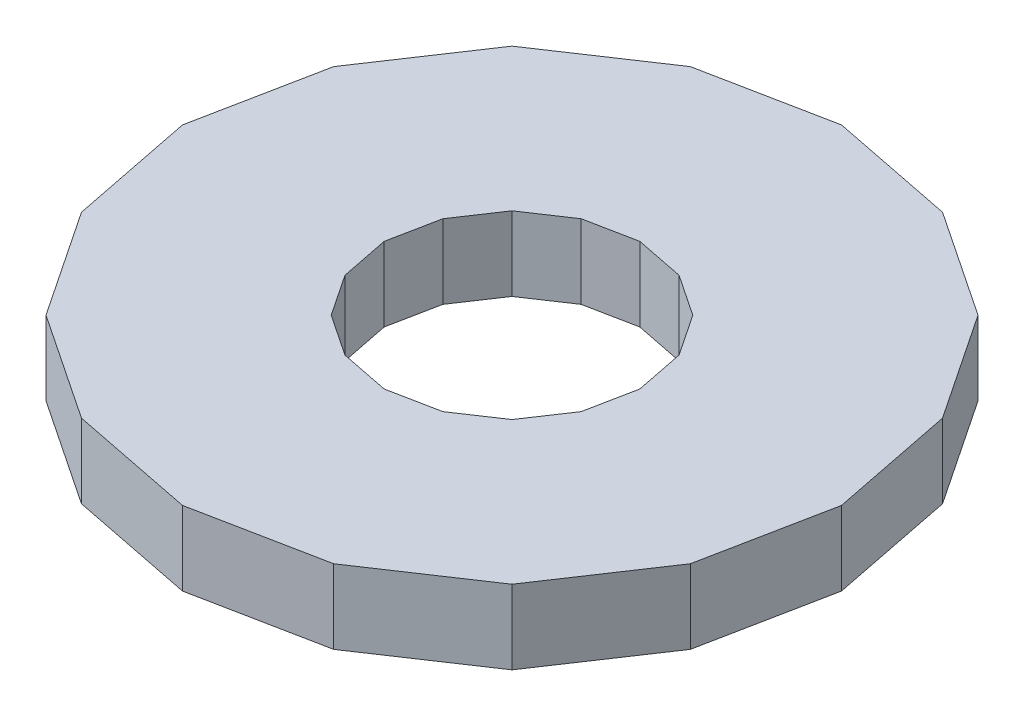
ISO-10303-21;
HEADER;
FILE_DESCRIPTION(('STEP AP214'),'2;1');
FILE_NAME('part.step','',(''),(''),'','','');
FILE_SCHEMA(('AUTOMOTIVE_DESIGN { 1 0 10303 214 1 1 1 1 }'));
ENDSEC;
DATA;
#1=APPLICATION_CONTEXT('core data for automotive mechanical design processes');
#2=APPLICATION_PROTOCOL_DEFINITION('international standard','automotive_design',2000,#1);
#3=PRODUCT_CONTEXT('',#1,'mechanical');
#4=PRODUCT('Part','Part','',(#3));
#5=PRODUCT_RELATED_PRODUCT_CATEGORY('part','',(#4));
#6=PRODUCT_DEFINITION_FORMATION('','',#4);
#7=PRODUCT_DEFINITION_CONTEXT('part definition',#1,'design');
#8=PRODUCT_DEFINITION('design','',#6,#7);
#9=PRODUCT_DEFINITION_SHAPE('','',#8);
#10=(LENGTH_UNIT() NAMED_UNIT(*) SI_UNIT(.MILLI.,.METRE.));
#11=(NAMED_UNIT(*) PLANE_ANGLE_UNIT() SI_UNIT($,.RADIAN.));
#12=(NAMED_UNIT(*) SI_UNIT($,.STERADIAN.) SOLID_ANGLE_UNIT());
#13=UNCERTAINTY_MEASURE_WITH_UNIT(LENGTH_MEASURE(1.E-05),#10,'distance_accuracy_value','');
#14=(GEOMETRIC_REPRESENTATION_CONTEXT(3) GLOBAL_UNCERTAINTY_ASSIGNED_CONTEXT((#13)) GLOBAL_UNIT_ASSIGNED_CONTEXT((#10,
#11,#12)) REPRESENTATION_CONTEXT('',''));
#15=CARTESIAN_POINT('',(0.,0.,0.));
#16=DIRECTION('',(0.,0.,1.));
#17=DIRECTION('',(1.,0.,0.));
#18=AXIS2_PLACEMENT_3D('',#15,#16,#17);
#19=CARTESIAN_POINT('',(0.,19.05,0.));
#20=DIRECTION('',(0.,1.,0.));
#21=DIRECTION('',(0.,0.,1.));
#22=AXIS2_PLACEMENT_3D('',#19,#20,#21);
#23=PLANE('',#22);
#24=DIRECTION('',(0.195090322016116,0.,-0.980785280403233));
#25=VECTOR('',#24,1.);
#26=CARTESIAN_POINT('',(78.1855856514525,19.05,32.3855299589137));
#27=LINE('',#26,#25);
#28=CARTESIAN_POINT('',(78.1855856514525,19.05,32.3855299589137));
#29=VERTEX_POINT('',#28);
#30=CARTESIAN_POINT('',(84.6274680844246,19.05,-1.06512029289064E-12));
#31=VERTEX_POINT('',#30);
#32=EDGE_CURVE('E386',#29,#31,#27,.T.);
#33=ORIENTED_EDGE('',*,*,#32,.T.);
#34=DIRECTION('',(-0.19509032201614,0.,-0.980785280403228));
#35=VECTOR('',#34,1.);
#36=CARTESIAN_POINT('',(84.6274680844246,19.05,-1.06512029289064E-12));
#37=LINE('',#36,#35);
#38=CARTESIAN_POINT('',(78.1855856514517,19.05,-32.3855299589157));
#39=VERTEX_POINT('',#38);
#40=EDGE_CURVE('E390',#31,#39,#37,.T.);
#41=ORIENTED_EDGE('',*,*,#40,.T.);
#42=DIRECTION('',(-0.555570233019613,0.,-0.831469612302538));
#43=VECTOR('',#42,1.);
#44=CARTESIAN_POINT('',(78.1855856514517,19.05,-32.3855299589157));
#45=LINE('',#44,#43);
#46=CARTESIAN_POINT('',(59.8406565571441,19.05,-59.8406565571455));
#47=VERTEX_POINT('',#46);
#48=EDGE_CURVE('E394',#39,#47,#45,.T.);
#49=ORIENTED_EDGE('',*,*,#48,.T.);
#50=DIRECTION('',(-0.831469612302552,0.,-0.555570233019592));
#51=VECTOR('',#50,1.);
#52=CARTESIAN_POINT('',(59.8406565571441,19.05,-59.8406565571455));
#53=LINE('',#52,#51);
#54=CARTESIAN_POINT('',(32.3855299589138,19.05,-78.1855856514524));
#55=VERTEX_POINT('',#54);
#56=EDGE_CURVE('E396',#47,#55,#53,.T.);
#57=ORIENTED_EDGE('',*,*,#56,.T.);
#58=DIRECTION('',(-0.980785280403233,0.,-0.195090322016116));
#59=VECTOR('',#58,1.);
#60=CARTESIAN_POINT('',(32.3855299589138,19.05,-78.1855856514524));
#61=LINE('',#60,#59);
#62=CARTESIAN_POINT('',(-1.04802127426119E-12,19.05,-84.6274680844246));
#63=VERTEX_POINT('',#62);
#64=EDGE_CURVE('E399',#55,#63,#61,.T.);
#65=ORIENTED_EDGE('',*,*,#64,.T.);
#66=DIRECTION('',(-0.980785280403228,0.,0.19509032201614));
#67=VECTOR('',#66,1.);
#68=CARTESIAN_POINT('',(-1.04802127426119E-12,19.05,-84.6274680844246));
#69=LINE('',#68,#67);
#70=CARTESIAN_POINT('',(-32.3855299589157,19.05,-78.1855856514516));
#71=VERTEX_POINT('',#70);
#72=EDGE_CURVE('E401',#63,#71,#69,.T.);
#73=ORIENTED_EDGE('',*,*,#72,.T.);
#74=DIRECTION('',(-0.831469612302538,0.,0.555570233019613));
#75=VECTOR('',#74,1.);
#76=CARTESIAN_POINT('',(-32.3855299589157,19.05,-78.1855856514516));
#77=LINE('',#76,#75);
#78=CARTESIAN_POINT('',(-59.8406565571455,19.05,-59.840656557144));
#79=VERTEX_POINT('',#78);
#80=EDGE_CURVE('E403',#71,#79,#77,.T.);
#81=ORIENTED_EDGE('',*,*,#80,.T.);
#82=DIRECTION('',(-0.555570233019592,0.,0.831469612302552));
#83=VECTOR('',#82,1.);
#84=CARTESIAN_POINT('',(-59.8406565571455,19.05,-59.840656557144));
#85=LINE('',#84,#83);
#86=CARTESIAN_POINT('',(-78.1855856514525,19.05,-32.3855299589137));
#87=VERTEX_POINT('',#86);
#88=EDGE_CURVE('E405',#79,#87,#85,.T.);
#89=ORIENTED_EDGE('',*,*,#88,.T.);
#90=DIRECTION('',(-0.195090322016116,0.,0.980785280403233));
#91=VECTOR('',#90,1.);
#92=CARTESIAN_POINT('',(-78.1855856514525,19.05,-32.3855299589137));
#93=LINE('',#92,#91);
#94=CARTESIAN_POINT('',(-84.6274680844246,19.05,9.98540423109598E-13));
#95=VERTEX_POINT('',#94);
#96=EDGE_CURVE('E407',#87,#95,#93,.T.);
#97=ORIENTED_EDGE('',*,*,#96,.T.);
#98=DIRECTION('',(0.19509032201614,0.,0.980785280403228));
#99=VECTOR('',#98,1.);
#100=CARTESIAN_POINT('',(-84.6274680844246,19.05,9.98540423109598E-13));
#101=LINE('',#100,#99);
#102=CARTESIAN_POINT('',(-78.1855856514517,19.05,32.3855299589157));
#103=VERTEX_POINT('',#102);
#104=EDGE_CURVE('E410',#95,#103,#101,.T.);
#105=ORIENTED_EDGE('',*,*,#104,.T.);
#106=DIRECTION('',(0.555570233019612,0.,0.831469612302538));
#107=VECTOR('',#106,1.);
#108=CARTESIAN_POINT('',(-78.1855856514517,19.05,32.3855299589157));
#109=LINE('',#108,#107);
#110=CARTESIAN_POINT('',(-59.840656557144,19.05,59.8406565571455));
#111=VERTEX_POINT('',#110);
#112=EDGE_CURVE('E412',#103,#111,#109,.T.);
#113=ORIENTED_EDGE('',*,*,#112,.T.);
#114=DIRECTION('',(0.831469612302552,0.,0.555570233019592));
#115=VECTOR('',#114,1.);
#116=CARTESIAN_POINT('',(-59.840656557144,19.05,59.8406565571455));
#117=LINE('',#116,#115);
#118=CARTESIAN_POINT('',(-32.3855299589137,19.05,78.1855856514525));
#119=VERTEX_POINT('',#118);
#120=EDGE_CURVE('E414',#111,#119,#117,.T.);
#121=ORIENTED_EDGE('',*,*,#120,.T.);
#122=DIRECTION('',(0.980785280403233,0.,0.195090322016117));
#123=VECTOR('',#122,1.);
#124=CARTESIAN_POINT('',(-32.3855299589137,19.05,78.1855856514525));
#125=LINE('',#124,#123);
#126=CARTESIAN_POINT('',(9.78485105776489E-13,19.05,84.6274680844246));
#127=VERTEX_POINT('',#126);
#128=EDGE_CURVE('E416',#119,#127,#125,.T.);
#129=ORIENTED_EDGE('',*,*,#128,.T.);
#130=DIRECTION('',(0.980785280403228,0.,-0.19509032201614));
#131=VECTOR('',#130,1.);
#132=CARTESIAN_POINT('',(9.78485105776489E-13,19.05,84.6274680844246));
#133=LINE('',#132,#131);
#134=CARTESIAN_POINT('',(32.3855299589157,19.05,78.1855856514517));
#135=VERTEX_POINT('',#134);
#136=EDGE_CURVE('E418',#127,#135,#133,.T.);
#137=ORIENTED_EDGE('',*,*,#136,.T.);
#138=DIRECTION('',(0.831469612302539,0.,-0.555570233019612));
#139=VECTOR('',#138,1.);
#140=CARTESIAN_POINT('',(32.3855299589157,19.05,78.1855856514517));
#141=LINE('',#140,#139);
#142=CARTESIAN_POINT('',(59.8406565571455,19.05,59.8406565571441));
#143=VERTEX_POINT('',#142);
#144=EDGE_CURVE('E421',#135,#143,#141,.T.);
#145=ORIENTED_EDGE('',*,*,#144,.T.);
#146=DIRECTION('',(0.555570233019592,0.,-0.831469612302552));
#147=VECTOR('',#146,1.);
#148=CARTESIAN_POINT('',(59.8406565571455,19.05,59.8406565571441));
#149=LINE('',#148,#147);
#150=EDGE_CURVE('E423',#143,#29,#149,.T.);
#151=ORIENTED_EDGE('',*,*,#150,.T.);
#152=EDGE_LOOP('',(#33,#41,#49,#57,#65,#73,#81,#89,#97,#105,#113,#121,#129,#137,#145,#151));
#153=FACE_BOUND('',#152,.T.);
#154=DIRECTION('',(-0.19509032201614,0.,-0.980785280403228));
#155=VECTOR('',#154,1.);
#156=CARTESIAN_POINT('',(32.8322372474421,19.05,-4.10181099499049E-13));
#157=LINE('',#156,#155);
#158=CARTESIAN_POINT('',(32.8322372474421,19.05,-4.10181099499049E-13));
#159=VERTEX_POINT('',#158);
#160=CARTESIAN_POINT('',(30.3330319994663,19.05,-12.5643532420765));
#161=VERTEX_POINT('',#160);
#162=EDGE_CURVE('E252',#159,#161,#157,.T.);
#163=ORIENTED_EDGE('',*,*,#162,.F.);
#164=DIRECTION('',(0.195090322016116,0.,-0.980785280403233));
#165=VECTOR('',#164,1.);
#166=CARTESIAN_POINT('',(30.3330319994666,19.05,12.5643532420757));
#167=LINE('',#166,#165);
#168=CARTESIAN_POINT('',(30.3330319994666,19.05,12.5643532420757));
#169=VERTEX_POINT('',#168);
#170=EDGE_CURVE('E243',#169,#159,#167,.T.);
#171=ORIENTED_EDGE('',*,*,#170,.F.);
#172=DIRECTION('',(0.555570233019592,0.,-0.831469612302552));
#173=VECTOR('',#172,1.);
#174=CARTESIAN_POINT('',(23.2158975991921,19.05,23.2158975991916));
#175=LINE('',#174,#173);
#176=CARTESIAN_POINT('',(23.2158975991921,19.05,23.2158975991916));
#177=VERTEX_POINT('',#176);
#178=EDGE_CURVE('E299',#177,#169,#175,.T.);
#179=ORIENTED_EDGE('',*,*,#178,.F.);
#180=DIRECTION('',(0.831469612302539,0.,-0.555570233019612));
#181=VECTOR('',#180,1.);
#182=CARTESIAN_POINT('',(12.5643532420765,19.05,30.3330319994663));
#183=LINE('',#182,#181);
#184=CARTESIAN_POINT('',(12.5643532420765,19.05,30.3330319994663));
#185=VERTEX_POINT('',#184);
#186=EDGE_CURVE('E296',#185,#177,#183,.T.);
#187=ORIENTED_EDGE('',*,*,#186,.F.);
#188=DIRECTION('',(0.980785280403228,0.,-0.19509032201614));
#189=VECTOR('',#188,1.);
#190=CARTESIAN_POINT('',(4.04886316716019E-13,19.05,32.8322372474421));
#191=LINE('',#190,#189);
#192=CARTESIAN_POINT('',(4.04886316716019E-13,19.05,32.8322372474421));
#193=VERTEX_POINT('',#192);
#194=EDGE_CURVE('E293',#193,#185,#191,.T.);
#195=ORIENTED_EDGE('',*,*,#194,.F.);
#196=DIRECTION('',(0.980785280403233,0.,0.195090322016117));
#197=VECTOR('',#196,1.);
#198=CARTESIAN_POINT('',(-12.5643532420757,19.05,30.3330319994666));
#199=LINE('',#198,#197);
#200=CARTESIAN_POINT('',(-12.5643532420757,19.05,30.3330319994666));
#201=VERTEX_POINT('',#200);
#202=EDGE_CURVE('E291',#201,#193,#199,.T.);
#203=ORIENTED_EDGE('',*,*,#202,.F.);
#204=DIRECTION('',(0.831469612302552,0.,0.555570233019592));
#205=VECTOR('',#204,1.);
#206=CARTESIAN_POINT('',(-23.2158975991915,19.05,23.2158975991921));
#207=LINE('',#206,#205);
#208=CARTESIAN_POINT('',(-23.2158975991915,19.05,23.2158975991921));
#209=VERTEX_POINT('',#208);
#210=EDGE_CURVE('E288',#209,#201,#207,.T.);
#211=ORIENTED_EDGE('',*,*,#210,.F.);
#212=DIRECTION('',(0.555570233019612,0.,0.831469612302538));
#213=VECTOR('',#212,1.);
#214=CARTESIAN_POINT('',(-30.3330319994663,19.05,12.5643532420764));
#215=LINE('',#214,#213);
#216=CARTESIAN_POINT('',(-30.3330319994663,19.05,12.5643532420764));
#217=VERTEX_POINT('',#216);
#218=EDGE_CURVE('E286',#217,#209,#215,.T.);
#219=ORIENTED_EDGE('',*,*,#218,.F.);
#220=DIRECTION('',(0.19509032201614,0.,0.980785280403228));
#221=VECTOR('',#220,1.);
#222=CARTESIAN_POINT('',(-32.8322372474421,19.05,4.14431526694049E-13));
#223=LINE('',#222,#221);
#224=CARTESIAN_POINT('',(-32.8322372474421,19.05,4.14431526694049E-13));
#225=VERTEX_POINT('',#224);
#226=EDGE_CURVE('E283',#225,#217,#223,.T.);
#227=ORIENTED_EDGE('',*,*,#226,.F.);
#228=DIRECTION('',(-0.195090322016116,0.,0.980785280403233));
#229=VECTOR('',#228,1.);
#230=CARTESIAN_POINT('',(-30.3330319994666,19.05,-12.5643532420757));
#231=LINE('',#230,#229);
#232=CARTESIAN_POINT('',(-30.3330319994666,19.05,-12.5643532420757));
#233=VERTEX_POINT('',#232);
#234=EDGE_CURVE('E281',#233,#225,#231,.T.);
#235=ORIENTED_EDGE('',*,*,#234,.F.);
#236=DIRECTION('',(-0.555570233019592,0.,0.831469612302552));
#237=VECTOR('',#236,1.);
#238=CARTESIAN_POINT('',(-23.2158975991921,19.05,-23.2158975991915));
#239=LINE('',#238,#237);
#240=CARTESIAN_POINT('',(-23.2158975991921,19.05,-23.2158975991915));
#241=VERTEX_POINT('',#240);
#242=EDGE_CURVE('E279',#241,#233,#239,.T.);
#243=ORIENTED_EDGE('',*,*,#242,.F.);
#244=DIRECTION('',(-0.831469612302538,0.,0.555570233019612));
#245=VECTOR('',#244,1.);
#246=CARTESIAN_POINT('',(-12.5643532420765,19.05,-30.3330319994663));
#247=LINE('',#246,#245);
#248=CARTESIAN_POINT('',(-12.5643532420765,19.05,-30.3330319994663));
#249=VERTEX_POINT('',#248);
#250=EDGE_CURVE('E276',#249,#241,#247,.T.);
#251=ORIENTED_EDGE('',*,*,#250,.F.);
#252=DIRECTION('',(-0.980785280403228,0.,0.19509032201614));
#253=VECTOR('',#252,1.);
#254=CARTESIAN_POINT('',(-3.85216939722335E-13,19.05,-32.8322372474421));
#255=LINE('',#254,#253);
#256=CARTESIAN_POINT('',(-3.85216939722335E-13,19.05,-32.8322372474421));
#257=VERTEX_POINT('',#256);
#258=EDGE_CURVE('E274',#257,#249,#255,.T.);
#259=ORIENTED_EDGE('',*,*,#258,.F.);
#260=DIRECTION('',(-0.980785280403233,0.,-0.195090322016116));
#261=VECTOR('',#260,1.);
#262=CARTESIAN_POINT('',(12.5643532420758,19.05,-30.3330319994666));
#263=LINE('',#262,#261);
#264=CARTESIAN_POINT('',(12.5643532420758,19.05,-30.3330319994666));
#265=VERTEX_POINT('',#264);
#266=EDGE_CURVE('E272',#265,#257,#263,.T.);
#267=ORIENTED_EDGE('',*,*,#266,.F.);
#268=DIRECTION('',(-0.831469612302552,0.,-0.555570233019592));
#269=VECTOR('',#268,1.);
#270=CARTESIAN_POINT('',(23.2158975991916,19.05,-23.2158975991921));
#271=LINE('',#270,#269);
#272=CARTESIAN_POINT('',(23.2158975991916,19.05,-23.2158975991921));
#273=VERTEX_POINT('',#272);
#274=EDGE_CURVE('E268',#273,#265,#271,.T.);
#275=ORIENTED_EDGE('',*,*,#274,.F.);
#276=DIRECTION('',(-0.555570233019612,0.,-0.831469612302538));
#277=VECTOR('',#276,1.);
#278=CARTESIAN_POINT('',(30.3330319994663,19.05,-12.5643532420765));
#279=LINE('',#278,#277);
#280=EDGE_CURVE('E266',#161,#273,#279,.T.);
#281=ORIENTED_EDGE('',*,*,#280,.F.);
#282=EDGE_LOOP('',(#163,#171,#179,#187,#195,#203,#211,#219,#227,#235,#243,#251,#259,#267,#275,#281));
#283=FACE_BOUND('',#282,.T.);
#284=ADVANCED_FACE('F34',(#153,#283),#23,.T.);
#285=CARTESIAN_POINT('',(0.,0.,0.));
#286=DIRECTION('',(0.,1.,0.));
#287=DIRECTION('',(0.,0.,1.));
#288=AXIS2_PLACEMENT_3D('',#285,#286,#287);
#289=PLANE('',#288);
#290=DIRECTION('',(0.195090322016116,0.,-0.980785280403233));
#291=VECTOR('',#290,1.);
#292=CARTESIAN_POINT('',(78.1855856514525,0.,32.3855299589137));
#293=LINE('',#292,#291);
#294=CARTESIAN_POINT('',(78.1855856514525,0.,32.3855299589137));
#295=VERTEX_POINT('',#294);
#296=CARTESIAN_POINT('',(84.6274680844246,0.,-1.06512029289064E-12));
#297=VERTEX_POINT('',#296);
#298=EDGE_CURVE('E261',#295,#297,#293,.T.);
#299=ORIENTED_EDGE('',*,*,#298,.F.);
#300=DIRECTION('',(0.555570233019592,0.,-0.831469612302552));
#301=VECTOR('',#300,1.);
#302=CARTESIAN_POINT('',(59.8406565571455,0.,59.8406565571441));
#303=LINE('',#302,#301);
#304=CARTESIAN_POINT('',(59.8406565571455,0.,59.8406565571441));
#305=VERTEX_POINT('',#304);
#306=EDGE_CURVE('E391',#305,#295,#303,.T.);
#307=ORIENTED_EDGE('',*,*,#306,.F.);
#308=DIRECTION('',(0.831469612302539,0.,-0.555570233019612));
#309=VECTOR('',#308,1.);
#310=CARTESIAN_POINT('',(32.3855299589157,0.,78.1855856514517));
#311=LINE('',#310,#309);
#312=CARTESIAN_POINT('',(32.3855299589157,0.,78.1855856514517));
#313=VERTEX_POINT('',#312);
#314=EDGE_CURVE('E458',#313,#305,#311,.T.);
#315=ORIENTED_EDGE('',*,*,#314,.F.);
#316=DIRECTION('',(0.980785280403228,0.,-0.19509032201614));
#317=VECTOR('',#316,1.);
#318=CARTESIAN_POINT('',(9.78485105776489E-13,0.,84.6274680844246));
#319=LINE('',#318,#317);
#320=CARTESIAN_POINT('',(9.78485105776489E-13,0.,84.6274680844246));
#321=VERTEX_POINT('',#320);
#322=EDGE_CURVE('E456',#321,#313,#319,.T.);
#323=ORIENTED_EDGE('',*,*,#322,.F.);
#324=DIRECTION('',(0.980785280403233,0.,0.195090322016117));
#325=VECTOR('',#324,1.);
#326=CARTESIAN_POINT('',(-32.3855299589137,0.,78.1855856514525));
#327=LINE('',#326,#325);
#328=CARTESIAN_POINT('',(-32.3855299589137,0.,78.1855856514525));
#329=VERTEX_POINT('',#328);
#330=EDGE_CURVE('E453',#329,#321,#327,.T.);
#331=ORIENTED_EDGE('',*,*,#330,.F.);
#332=DIRECTION('',(0.831469612302552,0.,0.555570233019592));
#333=VECTOR('',#332,1.);
#334=CARTESIAN_POINT('',(-59.840656557144,0.,59.8406565571455));
#335=LINE('',#334,#333);
#336=CARTESIAN_POINT('',(-59.840656557144,0.,59.8406565571455));
#337=VERTEX_POINT('',#336);
#338=EDGE_CURVE('E450',#337,#329,#335,.T.);
#339=ORIENTED_EDGE('',*,*,#338,.F.);
#340=DIRECTION('',(0.555570233019612,0.,0.831469612302538));
#341=VECTOR('',#340,1.);
#342=CARTESIAN_POINT('',(-78.1855856514517,0.,32.3855299589157));
#343=LINE('',#342,#341);
#344=CARTESIAN_POINT('',(-78.1855856514517,0.,32.3855299589157));
#345=VERTEX_POINT('',#344);
#346=EDGE_CURVE('E448',#345,#337,#343,.T.);
#347=ORIENTED_EDGE('',*,*,#346,.F.);
#348=DIRECTION('',(0.19509032201614,0.,0.980785280403228));
#349=VECTOR('',#348,1.);
#350=CARTESIAN_POINT('',(-84.6274680844246,0.,9.98540423109598E-13));
#351=LINE('',#350,#349);
#352=CARTESIAN_POINT('',(-84.6274680844246,0.,9.98540423109598E-13));
#353=VERTEX_POINT('',#352);
#354=EDGE_CURVE('E446',#353,#345,#351,.T.);
#355=ORIENTED_EDGE('',*,*,#354,.F.);
#356=DIRECTION('',(-0.195090322016116,0.,0.980785280403233));
#357=VECTOR('',#356,1.);
#358=CARTESIAN_POINT('',(-78.1855856514525,0.,-32.3855299589137));
#359=LINE('',#358,#357);
#360=CARTESIAN_POINT('',(-78.1855856514525,0.,-32.3855299589137));
#361=VERTEX_POINT('',#360);
#362=EDGE_CURVE('E444',#361,#353,#359,.T.);
#363=ORIENTED_EDGE('',*,*,#362,.F.);
#364=DIRECTION('',(-0.555570233019592,0.,0.831469612302552));
#365=VECTOR('',#364,1.);
#366=CARTESIAN_POINT('',(-59.8406565571455,0.,-59.840656557144));
#367=LINE('',#366,#365);
#368=CARTESIAN_POINT('',(-59.8406565571455,0.,-59.840656557144));
#369=VERTEX_POINT('',#368);
#370=EDGE_CURVE('E442',#369,#361,#367,.T.);
#371=ORIENTED_EDGE('',*,*,#370,.F.);
#372=DIRECTION('',(-0.831469612302538,0.,0.555570233019613));
#373=VECTOR('',#372,1.);
#374=CARTESIAN_POINT('',(-32.3855299589157,0.,-78.1855856514516));
#375=LINE('',#374,#373);
#376=CARTESIAN_POINT('',(-32.3855299589157,0.,-78.1855856514516));
#377=VERTEX_POINT('',#376);
#378=EDGE_CURVE('E440',#377,#369,#375,.T.);
#379=ORIENTED_EDGE('',*,*,#378,.F.);
#380=DIRECTION('',(-0.980785280403228,0.,0.19509032201614));
#381=VECTOR('',#380,1.);
#382=CARTESIAN_POINT('',(-1.04802127426119E-12,0.,-84.6274680844246));
#383=LINE('',#382,#381);
#384=CARTESIAN_POINT('',(-1.04802127426119E-12,0.,-84.6274680844246));
#385=VERTEX_POINT('',#384);
#386=EDGE_CURVE('E438',#385,#377,#383,.T.);
#387=ORIENTED_EDGE('',*,*,#386,.F.);
#388=DIRECTION('',(-0.980785280403233,0.,-0.195090322016116));
#389=VECTOR('',#388,1.);
#390=CARTESIAN_POINT('',(32.3855299589138,0.,-78.1855856514524));
#391=LINE('',#390,#389);
#392=CARTESIAN_POINT('',(32.3855299589138,0.,-78.1855856514524));
#393=VERTEX_POINT('',#392);
#394=EDGE_CURVE('E436',#393,#385,#391,.T.);
#395=ORIENTED_EDGE('',*,*,#394,.F.);
#396=DIRECTION('',(-0.831469612302552,0.,-0.555570233019592));
#397=VECTOR('',#396,1.);
#398=CARTESIAN_POINT('',(59.8406565571441,0.,-59.8406565571455));
#399=LINE('',#398,#397);
#400=CARTESIAN_POINT('',(59.8406565571441,0.,-59.8406565571455));
#401=VERTEX_POINT('',#400);
#402=EDGE_CURVE('E434',#401,#393,#399,.T.);
#403=ORIENTED_EDGE('',*,*,#402,.F.);
#404=DIRECTION('',(-0.555570233019613,0.,-0.831469612302538));
#405=VECTOR('',#404,1.);
#406=CARTESIAN_POINT('',(78.1855856514517,0.,-32.3855299589157));
#407=LINE('',#406,#405);
#408=CARTESIAN_POINT('',(78.1855856514517,0.,-32.3855299589157));
#409=VERTEX_POINT('',#408);
#410=EDGE_CURVE('E432',#409,#401,#407,.T.);
#411=ORIENTED_EDGE('',*,*,#410,.F.);
#412=DIRECTION('',(-0.19509032201614,0.,-0.980785280403228));
#413=VECTOR('',#412,1.);
#414=CARTESIAN_POINT('',(84.6274680844246,0.,-1.06512029289064E-12));
#415=LINE('',#414,#413);
#416=EDGE_CURVE('E429',#297,#409,#415,.T.);
#417=ORIENTED_EDGE('',*,*,#416,.F.);
#418=EDGE_LOOP('',(#299,#307,#315,#323,#331,#339,#347,#355,#363,#371,#379,#387,#395,#403,#411,#417));
#419=FACE_BOUND('',#418,.T.);
#420=DIRECTION('',(0.195090322016116,0.,-0.980785280403233));
#421=VECTOR('',#420,1.);
#422=CARTESIAN_POINT('',(30.3330319994666,0.,12.5643532420757));
#423=LINE('',#422,#421);
#424=CARTESIAN_POINT('',(30.3330319994666,0.,12.5643532420757));
#425=VERTEX_POINT('',#424);
#426=CARTESIAN_POINT('',(32.8322372474421,0.,-4.10181099499049E-13));
#427=VERTEX_POINT('',#426);
#428=EDGE_CURVE('E57',#425,#427,#423,.T.);
#429=ORIENTED_EDGE('',*,*,#428,.T.);
#430=DIRECTION('',(-0.19509032201614,0.,-0.980785280403228));
#431=VECTOR('',#430,1.);
#432=CARTESIAN_POINT('',(32.8322372474421,0.,-4.10181099499049E-13));
#433=LINE('',#432,#431);
#434=CARTESIAN_POINT('',(30.3330319994663,0.,-12.5643532420765));
#435=VERTEX_POINT('',#434);
#436=EDGE_CURVE('E259',#427,#435,#433,.T.);
#437=ORIENTED_EDGE('',*,*,#436,.T.);
#438=DIRECTION('',(-0.555570233019612,0.,-0.831469612302538));
#439=VECTOR('',#438,1.);
#440=CARTESIAN_POINT('',(30.3330319994663,0.,-12.5643532420765));
#441=LINE('',#440,#439);
#442=CARTESIAN_POINT('',(23.2158975991916,0.,-23.2158975991921));
#443=VERTEX_POINT('',#442);
#444=EDGE_CURVE('E304',#435,#443,#441,.T.);
#445=ORIENTED_EDGE('',*,*,#444,.T.);
#446=DIRECTION('',(-0.831469612302552,0.,-0.555570233019592));
#447=VECTOR('',#446,1.);
#448=CARTESIAN_POINT('',(23.2158975991916,0.,-23.2158975991921));
#449=LINE('',#448,#447);
#450=CARTESIAN_POINT('',(12.5643532420758,0.,-30.3330319994666));
#451=VERTEX_POINT('',#450);
#452=EDGE_CURVE('E308',#443,#451,#449,.T.);
#453=ORIENTED_EDGE('',*,*,#452,.T.);
#454=DIRECTION('',(-0.980785280403233,0.,-0.195090322016116));
#455=VECTOR('',#454,1.);
#456=CARTESIAN_POINT('',(12.5643532420758,0.,-30.3330319994666));
#457=LINE('',#456,#455);
#458=CARTESIAN_POINT('',(-3.85216939722335E-13,0.,-32.8322372474421));
#459=VERTEX_POINT('',#458);
#460=EDGE_CURVE('E311',#451,#459,#457,.T.);
#461=ORIENTED_EDGE('',*,*,#460,.T.);
#462=DIRECTION('',(-0.980785280403228,0.,0.19509032201614));
#463=VECTOR('',#462,1.);
#464=CARTESIAN_POINT('',(-3.85216939722335E-13,0.,-32.8322372474421));
#465=LINE('',#464,#463);
#466=CARTESIAN_POINT('',(-12.5643532420765,0.,-30.3330319994663));
#467=VERTEX_POINT('',#466);
#468=EDGE_CURVE('E314',#459,#467,#465,.T.);
#469=ORIENTED_EDGE('',*,*,#468,.T.);
#470=DIRECTION('',(-0.831469612302538,0.,0.555570233019612));
#471=VECTOR('',#470,1.);
#472=CARTESIAN_POINT('',(-12.5643532420765,0.,-30.3330319994663));
#473=LINE('',#472,#471);
#474=CARTESIAN_POINT('',(-23.2158975991921,0.,-23.2158975991915));
#475=VERTEX_POINT('',#474);
#476=EDGE_CURVE('E317',#467,#475,#473,.T.);
#477=ORIENTED_EDGE('',*,*,#476,.T.);
#478=DIRECTION('',(-0.555570233019592,0.,0.831469612302552));
#479=VECTOR('',#478,1.);
#480=CARTESIAN_POINT('',(-23.2158975991921,0.,-23.2158975991915));
#481=LINE('',#480,#479);
#482=CARTESIAN_POINT('',(-30.3330319994666,0.,-12.5643532420757));
#483=VERTEX_POINT('',#482);
#484=EDGE_CURVE('E321',#475,#483,#481,.T.);
#485=ORIENTED_EDGE('',*,*,#484,.T.);
#486=DIRECTION('',(-0.195090322016116,0.,0.980785280403233));
#487=VECTOR('',#486,1.);
#488=CARTESIAN_POINT('',(-30.3330319994666,0.,-12.5643532420757));
#489=LINE('',#488,#487);
#490=CARTESIAN_POINT('',(-32.8322372474421,0.,4.14431526694049E-13));
#491=VERTEX_POINT('',#490);
#492=EDGE_CURVE('E325',#483,#491,#489,.T.);
#493=ORIENTED_EDGE('',*,*,#492,.T.);
#494=DIRECTION('',(0.19509032201614,0.,0.980785280403228));
#495=VECTOR('',#494,1.);
#496=CARTESIAN_POINT('',(-32.8322372474421,0.,4.14431526694049E-13));
#497=LINE('',#496,#495);
#498=CARTESIAN_POINT('',(-30.3330319994663,0.,12.5643532420764));
#499=VERTEX_POINT('',#498);
#500=EDGE_CURVE('E329',#491,#499,#497,.T.);
#501=ORIENTED_EDGE('',*,*,#500,.T.);
#502=DIRECTION('',(0.555570233019612,0.,0.831469612302538));
#503=VECTOR('',#502,1.);
#504=CARTESIAN_POINT('',(-30.3330319994663,0.,12.5643532420764));
#505=LINE('',#504,#503);
#506=CARTESIAN_POINT('',(-23.2158975991915,0.,23.2158975991921));
#507=VERTEX_POINT('',#506);
#508=EDGE_CURVE('E332',#499,#507,#505,.T.);
#509=ORIENTED_EDGE('',*,*,#508,.T.);
#510=DIRECTION('',(0.831469612302552,0.,0.555570233019592));
#511=VECTOR('',#510,1.);
#512=CARTESIAN_POINT('',(-23.2158975991915,0.,23.2158975991921));
#513=LINE('',#512,#511);
#514=CARTESIAN_POINT('',(-12.5643532420757,0.,30.3330319994666));
#515=VERTEX_POINT('',#514);
#516=EDGE_CURVE('E335',#507,#515,#513,.T.);
#517=ORIENTED_EDGE('',*,*,#516,.T.);
#518=DIRECTION('',(0.980785280403233,0.,0.195090322016117));
#519=VECTOR('',#518,1.);
#520=CARTESIAN_POINT('',(-12.5643532420757,0.,30.3330319994666));
#521=LINE('',#520,#519);
#522=CARTESIAN_POINT('',(4.04886316716019E-13,0.,32.8322372474421));
#523=VERTEX_POINT('',#522);
#524=EDGE_CURVE('E339',#515,#523,#521,.T.);
#525=ORIENTED_EDGE('',*,*,#524,.T.);
#526=DIRECTION('',(0.980785280403228,0.,-0.19509032201614));
#527=VECTOR('',#526,1.);
#528=CARTESIAN_POINT('',(4.04886316716019E-13,0.,32.8322372474421));
#529=LINE('',#528,#527);
#530=CARTESIAN_POINT('',(12.5643532420765,0.,30.3330319994663));
#531=VERTEX_POINT('',#530);
#532=EDGE_CURVE('E343',#523,#531,#529,.T.);
#533=ORIENTED_EDGE('',*,*,#532,.T.);
#534=DIRECTION('',(0.831469612302539,0.,-0.555570233019612));
#535=VECTOR('',#534,1.);
#536=CARTESIAN_POINT('',(12.5643532420765,0.,30.3330319994663));
#537=LINE('',#536,#535);
#538=CARTESIAN_POINT('',(23.2158975991921,0.,23.2158975991916));
#539=VERTEX_POINT('',#538);
#540=EDGE_CURVE('E347',#531,#539,#537,.T.);
#541=ORIENTED_EDGE('',*,*,#540,.T.);
#542=DIRECTION('',(0.555570233019592,0.,-0.831469612302552));
#543=VECTOR('',#542,1.);
#544=CARTESIAN_POINT('',(23.2158975991921,0.,23.2158975991916));
#545=LINE('',#544,#543);
#546=EDGE_CURVE('E253',#539,#425,#545,.T.);
#547=ORIENTED_EDGE('',*,*,#546,.T.);
#548=EDGE_LOOP('',(#429,#437,#445,#453,#461,#469,#477,#485,#493,#501,#509,#517,#525,#533,#541,#547));
#549=FACE_BOUND('',#548,.T.);
#550=ADVANCED_FACE('F517',(#419,#549),#289,.F.);
#551=CARTESIAN_POINT('',(78.1855856514525,19.05,32.3855299589137));
#552=DIRECTION('',(-0.980785280403233,0.,-0.195090322016116));
#553=DIRECTION('',(-0.195090322016116,0.,0.980785280403233));
#554=AXIS2_PLACEMENT_3D('',#551,#552,#553);
#555=PLANE('',#554);
#556=ORIENTED_EDGE('',*,*,#298,.T.);
#557=DIRECTION('',(0.,-1.,0.));
#558=VECTOR('',#557,1.);
#559=CARTESIAN_POINT('',(84.6274680844246,19.05,-1.06512029289064E-12));
#560=LINE('',#559,#558);
#561=EDGE_CURVE('E11',#31,#297,#560,.T.);
#562=ORIENTED_EDGE('',*,*,#561,.F.);
#563=ORIENTED_EDGE('',*,*,#32,.F.);
#564=DIRECTION('',(0.,-1.,0.));
#565=VECTOR('',#564,1.);
#566=CARTESIAN_POINT('',(78.1855856514525,19.05,32.3855299589137));
#567=LINE('',#566,#565);
#568=EDGE_CURVE('E425',#29,#295,#567,.T.);
#569=ORIENTED_EDGE('',*,*,#568,.T.);
#570=EDGE_LOOP('',(#556,#562,#563,#569));
#571=FACE_BOUND('',#570,.T.);
#572=ADVANCED_FACE('F36',(#571),#555,.F.);
#573=CARTESIAN_POINT('',(84.6274680844246,19.05,-1.06512029289064E-12));
#574=DIRECTION('',(-0.980785280403228,0.,0.19509032201614));
#575=DIRECTION('',(0.19509032201614,0.,0.980785280403228));
#576=AXIS2_PLACEMENT_3D('',#573,#574,#575);
#577=PLANE('',#576);
#578=ORIENTED_EDGE('',*,*,#416,.T.);
#579=DIRECTION('',(0.,-1.,0.));
#580=VECTOR('',#579,1.);
#581=CARTESIAN_POINT('',(78.1855856514517,19.05,-32.3855299589157));
#582=LINE('',#581,#580);
#583=EDGE_CURVE('E42',#39,#409,#582,.T.);
#584=ORIENTED_EDGE('',*,*,#583,.F.);
#585=ORIENTED_EDGE('',*,*,#40,.F.);
#586=ORIENTED_EDGE('',*,*,#561,.T.);
#587=EDGE_LOOP('',(#578,#584,#585,#586));
#588=FACE_BOUND('',#587,.T.);
#589=ADVANCED_FACE('F534',(#588),#577,.F.);
#590=CARTESIAN_POINT('',(78.1855856514517,19.05,-32.3855299589157));
#591=DIRECTION('',(-0.831469612302538,0.,0.555570233019613));
#592=DIRECTION('',(0.555570233019613,0.,0.831469612302538));
#593=AXIS2_PLACEMENT_3D('',#590,#591,#592);
#594=PLANE('',#593);
#595=ORIENTED_EDGE('',*,*,#410,.T.);
#596=DIRECTION('',(0.,-1.,0.));
#597=VECTOR('',#596,1.);
#598=CARTESIAN_POINT('',(59.8406565571441,19.05,-59.8406565571455));
#599=LINE('',#598,#597);
#600=EDGE_CURVE('E503',#47,#401,#599,.T.);
#601=ORIENTED_EDGE('',*,*,#600,.F.);
#602=ORIENTED_EDGE('',*,*,#48,.F.);
#603=ORIENTED_EDGE('',*,*,#583,.T.);
#604=EDGE_LOOP('',(#595,#601,#602,#603));
#605=FACE_BOUND('',#604,.T.);
#606=ADVANCED_FACE('F511',(#605),#594,.F.);
#607=CARTESIAN_POINT('',(59.8406565571441,19.05,-59.8406565571455));
#608=DIRECTION('',(-0.555570233019592,0.,0.831469612302552));
#609=DIRECTION('',(0.831469612302552,0.,0.555570233019592));
#610=AXIS2_PLACEMENT_3D('',#607,#608,#609);
#611=PLANE('',#610);
#612=ORIENTED_EDGE('',*,*,#402,.T.);
#613=DIRECTION('',(0.,-1.,0.));
#614=VECTOR('',#613,1.);
#615=CARTESIAN_POINT('',(32.3855299589138,19.05,-78.1855856514524));
#616=LINE('',#615,#614);
#617=EDGE_CURVE('E499',#55,#393,#616,.T.);
#618=ORIENTED_EDGE('',*,*,#617,.F.);
#619=ORIENTED_EDGE('',*,*,#56,.F.);
#620=ORIENTED_EDGE('',*,*,#600,.T.);
#621=EDGE_LOOP('',(#612,#618,#619,#620));
#622=FACE_BOUND('',#621,.T.);
#623=ADVANCED_FACE('F523',(#622),#611,.F.);
#624=CARTESIAN_POINT('',(32.3855299589138,19.05,-78.1855856514524));
#625=DIRECTION('',(-0.195090322016116,0.,0.980785280403233));
#626=DIRECTION('',(0.980785280403233,0.,0.195090322016117));
#627=AXIS2_PLACEMENT_3D('',#624,#625,#626);
#628=PLANE('',#627);
#629=ORIENTED_EDGE('',*,*,#394,.T.);
#630=DIRECTION('',(0.,-1.,0.));
#631=VECTOR('',#630,1.);
#632=CARTESIAN_POINT('',(-1.04802127426119E-12,19.05,-84.6274680844246));
#633=LINE('',#632,#631);
#634=EDGE_CURVE('E496',#63,#385,#633,.T.);
#635=ORIENTED_EDGE('',*,*,#634,.F.);
#636=ORIENTED_EDGE('',*,*,#64,.F.);
#637=ORIENTED_EDGE('',*,*,#617,.T.);
#638=EDGE_LOOP('',(#629,#635,#636,#637));
#639=FACE_BOUND('',#638,.T.);
#640=ADVANCED_FACE('F527',(#639),#628,.F.);
#641=CARTESIAN_POINT('',(-1.04802127426119E-12,19.05,-84.6274680844246));
#642=DIRECTION('',(0.19509032201614,0.,0.980785280403228));
#643=DIRECTION('',(0.980785280403228,0.,-0.19509032201614));
#644=AXIS2_PLACEMENT_3D('',#641,#642,#643);
#645=PLANE('',#644);
#646=ORIENTED_EDGE('',*,*,#386,.T.);
#647=DIRECTION('',(0.,-1.,0.));
#648=VECTOR('',#647,1.);
#649=CARTESIAN_POINT('',(-32.3855299589157,19.05,-78.1855856514516));
#650=LINE('',#649,#648);
#651=EDGE_CURVE('E493',#71,#377,#650,.T.);
#652=ORIENTED_EDGE('',*,*,#651,.F.);
#653=ORIENTED_EDGE('',*,*,#72,.F.);
#654=ORIENTED_EDGE('',*,*,#634,.T.);
#655=EDGE_LOOP('',(#646,#652,#653,#654));
#656=FACE_BOUND('',#655,.T.);
#657=ADVANCED_FACE('F587',(#656),#645,.F.);
#658=CARTESIAN_POINT('',(-32.3855299589157,19.05,-78.1855856514516));
#659=DIRECTION('',(0.555570233019613,0.,0.831469612302538));
#660=DIRECTION('',(0.831469612302538,0.,-0.555570233019613));
#661=AXIS2_PLACEMENT_3D('',#658,#659,#660);
#662=PLANE('',#661);
#663=ORIENTED_EDGE('',*,*,#378,.T.);
#664=DIRECTION('',(0.,-1.,0.));
#665=VECTOR('',#664,1.);
#666=CARTESIAN_POINT('',(-59.8406565571455,19.05,-59.840656557144));
#667=LINE('',#666,#665);
#668=EDGE_CURVE('E490',#79,#369,#667,.T.);
#669=ORIENTED_EDGE('',*,*,#668,.F.);
#670=ORIENTED_EDGE('',*,*,#80,.F.);
#671=ORIENTED_EDGE('',*,*,#651,.T.);
#672=EDGE_LOOP('',(#663,#669,#670,#671));
#673=FACE_BOUND('',#672,.T.);
#674=ADVANCED_FACE('F584',(#673),#662,.F.);
#675=CARTESIAN_POINT('',(-59.8406565571455,19.05,-59.840656557144));
#676=DIRECTION('',(0.831469612302552,0.,0.555570233019592));
#677=DIRECTION('',(0.555570233019592,0.,-0.831469612302552));
#678=AXIS2_PLACEMENT_3D('',#675,#676,#677);
#679=PLANE('',#678);
#680=ORIENTED_EDGE('',*,*,#370,.T.);
#681=DIRECTION('',(0.,-1.,0.));
#682=VECTOR('',#681,1.);
#683=CARTESIAN_POINT('',(-78.1855856514525,19.05,-32.3855299589137));
#684=LINE('',#683,#682);
#685=EDGE_CURVE('E487',#87,#361,#684,.T.);
#686=ORIENTED_EDGE('',*,*,#685,.F.);
#687=ORIENTED_EDGE('',*,*,#88,.F.);
#688=ORIENTED_EDGE('',*,*,#668,.T.);
#689=EDGE_LOOP('',(#680,#686,#687,#688));
#690=FACE_BOUND('',#689,.T.);
#691=ADVANCED_FACE('F580',(#690),#679,.F.);
#692=CARTESIAN_POINT('',(-78.1855856514525,19.05,-32.3855299589137));
#693=DIRECTION('',(0.980785280403233,0.,0.195090322016116));
#694=DIRECTION('',(0.195090322016116,0.,-0.980785280403233));
#695=AXIS2_PLACEMENT_3D('',#692,#693,#694);
#696=PLANE('',#695);
#697=ORIENTED_EDGE('',*,*,#362,.T.);
#698=DIRECTION('',(0.,-1.,0.));
#699=VECTOR('',#698,1.);
#700=CARTESIAN_POINT('',(-84.6274680844246,19.05,9.98540423109598E-13));
#701=LINE('',#700,#699);
#702=EDGE_CURVE('E484',#95,#353,#701,.T.);
#703=ORIENTED_EDGE('',*,*,#702,.F.);
#704=ORIENTED_EDGE('',*,*,#96,.F.);
#705=ORIENTED_EDGE('',*,*,#685,.T.);
#706=EDGE_LOOP('',(#697,#703,#704,#705));
#707=FACE_BOUND('',#706,.T.);
#708=ADVANCED_FACE('F576',(#707),#696,.F.);
#709=CARTESIAN_POINT('',(-84.6274680844246,19.05,9.98540423109598E-13));
#710=DIRECTION('',(0.980785280403228,0.,-0.19509032201614));
#711=DIRECTION('',(-0.19509032201614,0.,-0.980785280403228));
#712=AXIS2_PLACEMENT_3D('',#709,#710,#711);
#713=PLANE('',#712);
#714=ORIENTED_EDGE('',*,*,#354,.T.);
#715=DIRECTION('',(0.,-1.,0.));
#716=VECTOR('',#715,1.);
#717=CARTESIAN_POINT('',(-78.1855856514517,19.05,32.3855299589157));
#718=LINE('',#717,#716);
#719=EDGE_CURVE('E481',#103,#345,#718,.T.);
#720=ORIENTED_EDGE('',*,*,#719,.F.);
#721=ORIENTED_EDGE('',*,*,#104,.F.);
#722=ORIENTED_EDGE('',*,*,#702,.T.);
#723=EDGE_LOOP('',(#714,#720,#721,#722));
#724=FACE_BOUND('',#723,.T.);
#725=ADVANCED_FACE('F571',(#724),#713,.F.);
#726=CARTESIAN_POINT('',(-78.1855856514517,19.05,32.3855299589157));
#727=DIRECTION('',(0.831469612302539,0.,-0.555570233019612));
#728=DIRECTION('',(-0.555570233019612,0.,-0.831469612302539));
#729=AXIS2_PLACEMENT_3D('',#726,#727,#728);
#730=PLANE('',#729);
#731=ORIENTED_EDGE('',*,*,#346,.T.);
#732=DIRECTION('',(0.,-1.,0.));
#733=VECTOR('',#732,1.);
#734=CARTESIAN_POINT('',(-59.840656557144,19.05,59.8406565571455));
#735=LINE('',#734,#733);
#736=EDGE_CURVE('E478',#111,#337,#735,.T.);
#737=ORIENTED_EDGE('',*,*,#736,.F.);
#738=ORIENTED_EDGE('',*,*,#112,.F.);
#739=ORIENTED_EDGE('',*,*,#719,.T.);
#740=EDGE_LOOP('',(#731,#737,#738,#739));
#741=FACE_BOUND('',#740,.T.);
#742=ADVANCED_FACE('F565',(#741),#730,.F.);
#743=CARTESIAN_POINT('',(-59.840656557144,19.05,59.8406565571455));
#744=DIRECTION('',(0.555570233019592,0.,-0.831469612302552));
#745=DIRECTION('',(-0.831469612302552,0.,-0.555570233019592));
#746=AXIS2_PLACEMENT_3D('',#743,#744,#745);
#747=PLANE('',#746);
#748=ORIENTED_EDGE('',*,*,#338,.T.);
#749=DIRECTION('',(0.,-1.,0.));
#750=VECTOR('',#749,1.);
#751=CARTESIAN_POINT('',(-32.3855299589137,19.05,78.1855856514525));
#752=LINE('',#751,#750);
#753=EDGE_CURVE('E474',#119,#329,#752,.T.);
#754=ORIENTED_EDGE('',*,*,#753,.F.);
#755=ORIENTED_EDGE('',*,*,#120,.F.);
#756=ORIENTED_EDGE('',*,*,#736,.T.);
#757=EDGE_LOOP('',(#748,#754,#755,#756));
#758=FACE_BOUND('',#757,.T.);
#759=ADVANCED_FACE('F561',(#758),#747,.F.);
#760=CARTESIAN_POINT('',(-32.3855299589137,19.05,78.1855856514525));
#761=DIRECTION('',(0.195090322016117,0.,-0.980785280403233));
#762=DIRECTION('',(-0.980785280403233,0.,-0.195090322016117));
#763=AXIS2_PLACEMENT_3D('',#760,#761,#762);
#764=PLANE('',#763);
#765=ORIENTED_EDGE('',*,*,#330,.T.);
#766=DIRECTION('',(0.,-1.,0.));
#767=VECTOR('',#766,1.);
#768=CARTESIAN_POINT('',(9.78485105776489E-13,19.05,84.6274680844246));
#769=LINE('',#768,#767);
#770=EDGE_CURVE('E470',#127,#321,#769,.T.);
#771=ORIENTED_EDGE('',*,*,#770,.F.);
#772=ORIENTED_EDGE('',*,*,#128,.F.);
#773=ORIENTED_EDGE('',*,*,#753,.T.);
#774=EDGE_LOOP('',(#765,#771,#772,#773));
#775=FACE_BOUND('',#774,.T.);
#776=ADVANCED_FACE('F556',(#775),#764,.F.);
#777=CARTESIAN_POINT('',(9.78485105776489E-13,19.05,84.6274680844246));
#778=DIRECTION('',(-0.19509032201614,0.,-0.980785280403228));
#779=DIRECTION('',(-0.980785280403228,0.,0.19509032201614));
#780=AXIS2_PLACEMENT_3D('',#777,#778,#779);
#781=PLANE('',#780);
#782=ORIENTED_EDGE('',*,*,#322,.T.);
#783=DIRECTION('',(0.,-1.,0.));
#784=VECTOR('',#783,1.);
#785=CARTESIAN_POINT('',(32.3855299589157,19.05,78.1855856514517));
#786=LINE('',#785,#784);
#787=EDGE_CURVE('E466',#135,#313,#786,.T.);
#788=ORIENTED_EDGE('',*,*,#787,.F.);
#789=ORIENTED_EDGE('',*,*,#136,.F.);
#790=ORIENTED_EDGE('',*,*,#770,.T.);
#791=EDGE_LOOP('',(#782,#788,#789,#790));
#792=FACE_BOUND('',#791,.T.);
#793=ADVANCED_FACE('F550',(#792),#781,.F.);
#794=CARTESIAN_POINT('',(32.3855299589157,19.05,78.1855856514517));
#795=DIRECTION('',(-0.555570233019612,0.,-0.831469612302539));
#796=DIRECTION('',(-0.831469612302539,0.,0.555570233019612));
#797=AXIS2_PLACEMENT_3D('',#794,#795,#796);
#798=PLANE('',#797);
#799=ORIENTED_EDGE('',*,*,#314,.T.);
#800=DIRECTION('',(0.,-1.,0.));
#801=VECTOR('',#800,1.);
#802=CARTESIAN_POINT('',(59.8406565571455,19.05,59.8406565571441));
#803=LINE('',#802,#801);
#804=EDGE_CURVE('E463',#143,#305,#803,.T.);
#805=ORIENTED_EDGE('',*,*,#804,.F.);
#806=ORIENTED_EDGE('',*,*,#144,.F.);
#807=ORIENTED_EDGE('',*,*,#787,.T.);
#808=EDGE_LOOP('',(#799,#805,#806,#807));
#809=FACE_BOUND('',#808,.T.);
#810=ADVANCED_FACE('F546',(#809),#798,.F.);
#811=CARTESIAN_POINT('',(59.8406565571455,19.05,59.8406565571441));
#812=DIRECTION('',(-0.831469612302552,0.,-0.555570233019592));
#813=DIRECTION('',(-0.555570233019592,0.,0.831469612302552));
#814=AXIS2_PLACEMENT_3D('',#811,#812,#813);
#815=PLANE('',#814);
#816=ORIENTED_EDGE('',*,*,#306,.T.);
#817=ORIENTED_EDGE('',*,*,#568,.F.);
#818=ORIENTED_EDGE('',*,*,#150,.F.);
#819=ORIENTED_EDGE('',*,*,#804,.T.);
#820=EDGE_LOOP('',(#816,#817,#818,#819));
#821=FACE_BOUND('',#820,.T.);
#822=ADVANCED_FACE('F541',(#821),#815,.F.);
#823=CARTESIAN_POINT('',(30.3330319994666,19.05,12.5643532420757));
#824=DIRECTION('',(-0.980785280403233,0.,-0.195090322016116));
#825=DIRECTION('',(-0.195090322016116,0.,0.980785280403233));
#826=AXIS2_PLACEMENT_3D('',#823,#824,#825);
#827=PLANE('',#826);
#828=ORIENTED_EDGE('',*,*,#428,.F.);
#829=DIRECTION('',(0.,-1.,0.));
#830=VECTOR('',#829,1.);
#831=CARTESIAN_POINT('',(30.3330319994666,19.05,12.5643532420757));
#832=LINE('',#831,#830);
#833=EDGE_CURVE('E247',#169,#425,#832,.T.);
#834=ORIENTED_EDGE('',*,*,#833,.F.);
#835=ORIENTED_EDGE('',*,*,#170,.T.);
#836=DIRECTION('',(0.,-1.,0.));
#837=VECTOR('',#836,1.);
#838=CARTESIAN_POINT('',(32.8322372474421,19.05,-4.10181099499049E-13));
#839=LINE('',#838,#837);
#840=EDGE_CURVE('E246',#159,#427,#839,.T.);
#841=ORIENTED_EDGE('',*,*,#840,.T.);
#842=EDGE_LOOP('',(#828,#834,#835,#841));
#843=FACE_BOUND('',#842,.T.);
#844=ADVANCED_FACE('F245',(#843),#827,.T.);
#845=CARTESIAN_POINT('',(32.8322372474421,19.05,-4.10181099499049E-13));
#846=DIRECTION('',(-0.980785280403228,0.,0.19509032201614));
#847=DIRECTION('',(0.19509032201614,0.,0.980785280403228));
#848=AXIS2_PLACEMENT_3D('',#845,#846,#847);
#849=PLANE('',#848);
#850=ORIENTED_EDGE('',*,*,#436,.F.);
#851=ORIENTED_EDGE('',*,*,#840,.F.);
#852=ORIENTED_EDGE('',*,*,#162,.T.);
#853=DIRECTION('',(0.,-1.,0.));
#854=VECTOR('',#853,1.);
#855=CARTESIAN_POINT('',(30.3330319994663,19.05,-12.5643532420765));
#856=LINE('',#855,#854);
#857=EDGE_CURVE('E262',#161,#435,#856,.T.);
#858=ORIENTED_EDGE('',*,*,#857,.T.);
#859=EDGE_LOOP('',(#850,#851,#852,#858));
#860=FACE_BOUND('',#859,.T.);
#861=ADVANCED_FACE('F256',(#860),#849,.T.);
#862=CARTESIAN_POINT('',(30.3330319994663,19.05,-12.5643532420765));
#863=DIRECTION('',(-0.831469612302538,0.,0.555570233019613));
#864=DIRECTION('',(0.555570233019613,0.,0.831469612302538));
#865=AXIS2_PLACEMENT_3D('',#862,#863,#864);
#866=PLANE('',#865);
#867=ORIENTED_EDGE('',*,*,#444,.F.);
#868=ORIENTED_EDGE('',*,*,#857,.F.);
#869=ORIENTED_EDGE('',*,*,#280,.T.);
#870=DIRECTION('',(0.,-1.,0.));
#871=VECTOR('',#870,1.);
#872=CARTESIAN_POINT('',(23.2158975991916,19.05,-23.2158975991921));
#873=LINE('',#872,#871);
#874=EDGE_CURVE('E382',#273,#443,#873,.T.);
#875=ORIENTED_EDGE('',*,*,#874,.T.);
#876=EDGE_LOOP('',(#867,#868,#869,#875));
#877=FACE_BOUND('',#876,.T.);
#878=ADVANCED_FACE('F669',(#877),#866,.T.);
#879=CARTESIAN_POINT('',(23.2158975991916,19.05,-23.2158975991921));
#880=DIRECTION('',(-0.555570233019592,0.,0.831469612302552));
#881=DIRECTION('',(0.831469612302552,0.,0.555570233019592));
#882=AXIS2_PLACEMENT_3D('',#879,#880,#881);
#883=PLANE('',#882);
#884=ORIENTED_EDGE('',*,*,#452,.F.);
#885=ORIENTED_EDGE('',*,*,#874,.F.);
#886=ORIENTED_EDGE('',*,*,#274,.T.);
#887=DIRECTION('',(0.,-1.,0.));
#888=VECTOR('',#887,1.);
#889=CARTESIAN_POINT('',(12.5643532420758,19.05,-30.3330319994666));
#890=LINE('',#889,#888);
#891=EDGE_CURVE('E380',#265,#451,#890,.T.);
#892=ORIENTED_EDGE('',*,*,#891,.T.);
#893=EDGE_LOOP('',(#884,#885,#886,#892));
#894=FACE_BOUND('',#893,.T.);
#895=ADVANCED_FACE('F675',(#894),#883,.T.);
#896=CARTESIAN_POINT('',(12.5643532420758,19.05,-30.3330319994666));
#897=DIRECTION('',(-0.195090322016116,0.,0.980785280403233));
#898=DIRECTION('',(0.980785280403233,0.,0.195090322016116));
#899=AXIS2_PLACEMENT_3D('',#896,#897,#898);
#900=PLANE('',#899);
#901=ORIENTED_EDGE('',*,*,#460,.F.);
#902=ORIENTED_EDGE('',*,*,#891,.F.);
#903=ORIENTED_EDGE('',*,*,#266,.T.);
#904=DIRECTION('',(0.,-1.,0.));
#905=VECTOR('',#904,1.);
#906=CARTESIAN_POINT('',(-3.85216939722335E-13,19.05,-32.8322372474421));
#907=LINE('',#906,#905);
#908=EDGE_CURVE('E378',#257,#459,#907,.T.);
#909=ORIENTED_EDGE('',*,*,#908,.T.);
#910=EDGE_LOOP('',(#901,#902,#903,#909));
#911=FACE_BOUND('',#910,.T.);
#912=ADVANCED_FACE('F683',(#911),#900,.T.);
#913=CARTESIAN_POINT('',(-3.85216939722335E-13,19.05,-32.8322372474421));
#914=DIRECTION('',(0.19509032201614,0.,0.980785280403228));
#915=DIRECTION('',(0.980785280403228,0.,-0.19509032201614));
#916=AXIS2_PLACEMENT_3D('',#913,#914,#915);
#917=PLANE('',#916);
#918=ORIENTED_EDGE('',*,*,#468,.F.);
#919=ORIENTED_EDGE('',*,*,#908,.F.);
#920=ORIENTED_EDGE('',*,*,#258,.T.);
#921=DIRECTION('',(0.,-1.,0.));
#922=VECTOR('',#921,1.);
#923=CARTESIAN_POINT('',(-12.5643532420765,19.05,-30.3330319994663));
#924=LINE('',#923,#922);
#925=EDGE_CURVE('E376',#249,#467,#924,.T.);
#926=ORIENTED_EDGE('',*,*,#925,.T.);
#927=EDGE_LOOP('',(#918,#919,#920,#926));
#928=FACE_BOUND('',#927,.T.);
#929=ADVANCED_FACE('F691',(#928),#917,.T.);
#930=CARTESIAN_POINT('',(-12.5643532420765,19.05,-30.3330319994663));
#931=DIRECTION('',(0.555570233019613,0.,0.831469612302538));
#932=DIRECTION('',(0.831469612302538,0.,-0.555570233019613));
#933=AXIS2_PLACEMENT_3D('',#930,#931,#932);
#934=PLANE('',#933);
#935=ORIENTED_EDGE('',*,*,#476,.F.);
#936=ORIENTED_EDGE('',*,*,#925,.F.);
#937=ORIENTED_EDGE('',*,*,#250,.T.);
#938=DIRECTION('',(0.,-1.,0.));
#939=VECTOR('',#938,1.);
#940=CARTESIAN_POINT('',(-23.2158975991921,19.05,-23.2158975991915));
#941=LINE('',#940,#939);
#942=EDGE_CURVE('E374',#241,#475,#941,.T.);
#943=ORIENTED_EDGE('',*,*,#942,.T.);
#944=EDGE_LOOP('',(#935,#936,#937,#943));
#945=FACE_BOUND('',#944,.T.);
#946=ADVANCED_FACE('F699',(#945),#934,.T.);
#947=CARTESIAN_POINT('',(-23.2158975991921,19.05,-23.2158975991915));
#948=DIRECTION('',(0.831469612302552,0.,0.555570233019592));
#949=DIRECTION('',(0.555570233019592,0.,-0.831469612302552));
#950=AXIS2_PLACEMENT_3D('',#947,#948,#949);
#951=PLANE('',#950);
#952=ORIENTED_EDGE('',*,*,#484,.F.);
#953=ORIENTED_EDGE('',*,*,#942,.F.);
#954=ORIENTED_EDGE('',*,*,#242,.T.);
#955=DIRECTION('',(0.,-1.,0.));
#956=VECTOR('',#955,1.);
#957=CARTESIAN_POINT('',(-30.3330319994666,19.05,-12.5643532420757));
#958=LINE('',#957,#956);
#959=EDGE_CURVE('E371',#233,#483,#958,.T.);
#960=ORIENTED_EDGE('',*,*,#959,.T.);
#961=EDGE_LOOP('',(#952,#953,#954,#960));
#962=FACE_BOUND('',#961,.T.);
#963=ADVANCED_FACE('F708',(#962),#951,.T.);
#964=CARTESIAN_POINT('',(-30.3330319994666,19.05,-12.5643532420757));
#965=DIRECTION('',(0.980785280403233,0.,0.195090322016116));
#966=DIRECTION('',(0.195090322016116,0.,-0.980785280403233));
#967=AXIS2_PLACEMENT_3D('',#964,#965,#966);
#968=PLANE('',#967);
#969=ORIENTED_EDGE('',*,*,#492,.F.);
#970=ORIENTED_EDGE('',*,*,#959,.F.);
#971=ORIENTED_EDGE('',*,*,#234,.T.);
#972=DIRECTION('',(0.,-1.,0.));
#973=VECTOR('',#972,1.);
#974=CARTESIAN_POINT('',(-32.8322372474421,19.05,4.14431526694049E-13));
#975=LINE('',#974,#973);
#976=EDGE_CURVE('E368',#225,#491,#975,.T.);
#977=ORIENTED_EDGE('',*,*,#976,.T.);
#978=EDGE_LOOP('',(#969,#970,#971,#977));
#979=FACE_BOUND('',#978,.T.);
#980=ADVANCED_FACE('F715',(#979),#968,.T.);
#981=CARTESIAN_POINT('',(-32.8322372474421,19.05,4.14431526694049E-13));
#982=DIRECTION('',(0.980785280403228,0.,-0.19509032201614));
#983=DIRECTION('',(-0.19509032201614,0.,-0.980785280403228));
#984=AXIS2_PLACEMENT_3D('',#981,#982,#983);
#985=PLANE('',#984);
#986=ORIENTED_EDGE('',*,*,#500,.F.);
#987=ORIENTED_EDGE('',*,*,#976,.F.);
#988=ORIENTED_EDGE('',*,*,#226,.T.);
#989=DIRECTION('',(0.,-1.,0.));
#990=VECTOR('',#989,1.);
#991=CARTESIAN_POINT('',(-30.3330319994663,19.05,12.5643532420764));
#992=LINE('',#991,#990);
#993=EDGE_CURVE('E365',#217,#499,#992,.T.);
#994=ORIENTED_EDGE('',*,*,#993,.T.);
#995=EDGE_LOOP('',(#986,#987,#988,#994));
#996=FACE_BOUND('',#995,.T.);
#997=ADVANCED_FACE('F723',(#996),#985,.T.);
#998=CARTESIAN_POINT('',(-30.3330319994663,19.05,12.5643532420764));
#999=DIRECTION('',(0.831469612302538,0.,-0.555570233019612));
#1000=DIRECTION('',(-0.555570233019613,0.,-0.831469612302539));
#1001=AXIS2_PLACEMENT_3D('',#998,#999,#1000);
#1002=PLANE('',#1001);
#1003=ORIENTED_EDGE('',*,*,#508,.F.);
#1004=ORIENTED_EDGE('',*,*,#993,.F.);
#1005=ORIENTED_EDGE('',*,*,#218,.T.);
#1006=DIRECTION('',(0.,-1.,0.));
#1007=VECTOR('',#1006,1.);
#1008=CARTESIAN_POINT('',(-23.2158975991915,19.05,23.2158975991921));
#1009=LINE('',#1008,#1007);
#1010=EDGE_CURVE('E362',#209,#507,#1009,.T.);
#1011=ORIENTED_EDGE('',*,*,#1010,.T.);
#1012=EDGE_LOOP('',(#1003,#1004,#1005,#1011));
#1013=FACE_BOUND('',#1012,.T.);
#1014=ADVANCED_FACE('F731',(#1013),#1002,.T.);
#1015=CARTESIAN_POINT('',(-23.2158975991915,19.05,23.2158975991921));
#1016=DIRECTION('',(0.555570233019592,0.,-0.831469612302552));
#1017=DIRECTION('',(-0.831469612302552,0.,-0.555570233019592));
#1018=AXIS2_PLACEMENT_3D('',#1015,#1016,#1017);
#1019=PLANE('',#1018);
#1020=ORIENTED_EDGE('',*,*,#516,.F.);
#1021=ORIENTED_EDGE('',*,*,#1010,.F.);
#1022=ORIENTED_EDGE('',*,*,#210,.T.);
#1023=DIRECTION('',(0.,-1.,0.));
#1024=VECTOR('',#1023,1.);
#1025=CARTESIAN_POINT('',(-12.5643532420757,19.05,30.3330319994666));
#1026=LINE('',#1025,#1024);
#1027=EDGE_CURVE('E360',#201,#515,#1026,.T.);
#1028=ORIENTED_EDGE('',*,*,#1027,.T.);
#1029=EDGE_LOOP('',(#1020,#1021,#1022,#1028));
#1030=FACE_BOUND('',#1029,.T.);
#1031=ADVANCED_FACE('F739',(#1030),#1019,.T.);
#1032=CARTESIAN_POINT('',(-12.5643532420757,19.05,30.3330319994666));
#1033=DIRECTION('',(0.195090322016117,0.,-0.980785280403233));
#1034=DIRECTION('',(-0.980785280403233,0.,-0.195090322016117));
#1035=AXIS2_PLACEMENT_3D('',#1032,#1033,#1034);
#1036=PLANE('',#1035);
#1037=ORIENTED_EDGE('',*,*,#524,.F.);
#1038=ORIENTED_EDGE('',*,*,#1027,.F.);
#1039=ORIENTED_EDGE('',*,*,#202,.T.);
#1040=DIRECTION('',(0.,-1.,0.));
#1041=VECTOR('',#1040,1.);
#1042=CARTESIAN_POINT('',(4.04886316716019E-13,19.05,32.8322372474421));
#1043=LINE('',#1042,#1041);
#1044=EDGE_CURVE('E358',#193,#523,#1043,.T.);
#1045=ORIENTED_EDGE('',*,*,#1044,.T.);
#1046=EDGE_LOOP('',(#1037,#1038,#1039,#1045));
#1047=FACE_BOUND('',#1046,.T.);
#1048=ADVANCED_FACE('F747',(#1047),#1036,.T.);
#1049=CARTESIAN_POINT('',(4.04886316716019E-13,19.05,32.8322372474421));
#1050=DIRECTION('',(-0.19509032201614,0.,-0.980785280403228));
#1051=DIRECTION('',(-0.980785280403228,0.,0.19509032201614));
#1052=AXIS2_PLACEMENT_3D('',#1049,#1050,#1051);
#1053=PLANE('',#1052);
#1054=ORIENTED_EDGE('',*,*,#532,.F.);
#1055=ORIENTED_EDGE('',*,*,#1044,.F.);
#1056=ORIENTED_EDGE('',*,*,#194,.T.);
#1057=DIRECTION('',(0.,-1.,0.));
#1058=VECTOR('',#1057,1.);
#1059=CARTESIAN_POINT('',(12.5643532420765,19.05,30.3330319994663));
#1060=LINE('',#1059,#1058);
#1061=EDGE_CURVE('E356',#185,#531,#1060,.T.);
#1062=ORIENTED_EDGE('',*,*,#1061,.T.);
#1063=EDGE_LOOP('',(#1054,#1055,#1056,#1062));
#1064=FACE_BOUND('',#1063,.T.);
#1065=ADVANCED_FACE('F755',(#1064),#1053,.T.);
#1066=CARTESIAN_POINT('',(12.5643532420765,19.05,30.3330319994663));
#1067=DIRECTION('',(-0.555570233019612,0.,-0.831469612302539));
#1068=DIRECTION('',(-0.831469612302539,0.,0.555570233019612));
#1069=AXIS2_PLACEMENT_3D('',#1066,#1067,#1068);
#1070=PLANE('',#1069);
#1071=ORIENTED_EDGE('',*,*,#540,.F.);
#1072=ORIENTED_EDGE('',*,*,#1061,.F.);
#1073=ORIENTED_EDGE('',*,*,#186,.T.);
#1074=DIRECTION('',(0.,-1.,0.));
#1075=VECTOR('',#1074,1.);
#1076=CARTESIAN_POINT('',(23.2158975991921,19.05,23.2158975991916));
#1077=LINE('',#1076,#1075);
#1078=EDGE_CURVE('E49',#177,#539,#1077,.T.);
#1079=ORIENTED_EDGE('',*,*,#1078,.T.);
#1080=EDGE_LOOP('',(#1071,#1072,#1073,#1079));
#1081=FACE_BOUND('',#1080,.T.);
#1082=ADVANCED_FACE('F763',(#1081),#1070,.T.);
#1083=CARTESIAN_POINT('',(23.2158975991921,19.05,23.2158975991916));
#1084=DIRECTION('',(-0.831469612302552,0.,-0.555570233019592));
#1085=DIRECTION('',(-0.555570233019592,0.,0.831469612302552));
#1086=AXIS2_PLACEMENT_3D('',#1083,#1084,#1085);
#1087=PLANE('',#1086);
#1088=ORIENTED_EDGE('',*,*,#546,.F.);
#1089=ORIENTED_EDGE('',*,*,#1078,.F.);
#1090=ORIENTED_EDGE('',*,*,#178,.T.);
#1091=ORIENTED_EDGE('',*,*,#833,.T.);
#1092=EDGE_LOOP('',(#1088,#1089,#1090,#1091));
#1093=FACE_BOUND('',#1092,.T.);
#1094=ADVANCED_FACE('F771',(#1093),#1087,.T.);
#1095=CLOSED_SHELL('',(#284,#550,#572,#589,#606,#623,#640,#657,#674,#691,#708,#725,#742,#759,
#776,#793,#810,#822,#844,#861,#878,#895,#912,#929,#946,#963,#980,#997,#1014,#1031,#1048,#1065,
#1082,#1094));
#1096=MANIFOLD_SOLID_BREP('B2',#1095);
#1097=ADVANCED_BREP_SHAPE_REPRESENTATION('',(#18,#1096),#14);
#1098=SHAPE_DEFINITION_REPRESENTATION(#9,#1097);
ENDSEC;
END-ISO-10303-21;
